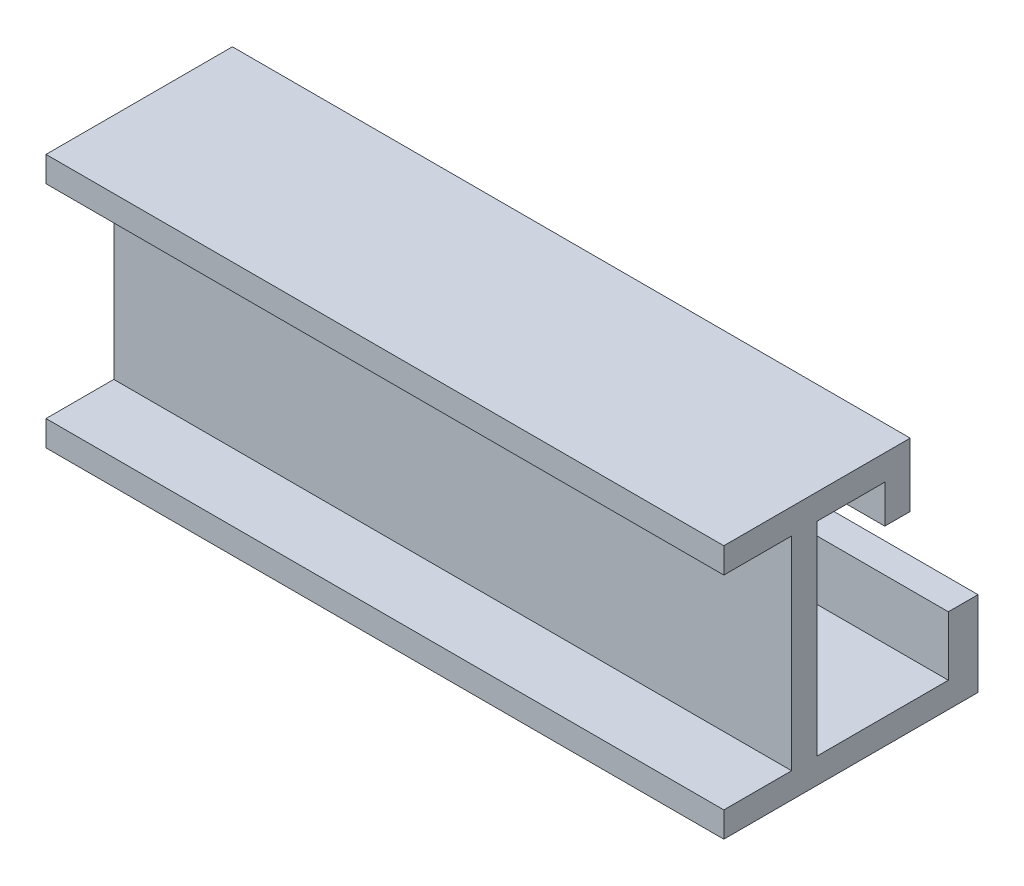
ISO-10303-21;
HEADER;
FILE_DESCRIPTION(('STEP AP214'),'2;1');
FILE_NAME('part.step','',(''),(''),'','','');
FILE_SCHEMA(('AUTOMOTIVE_DESIGN { 1 0 10303 214 1 1 1 1 }'));
ENDSEC;
DATA;
#1=APPLICATION_CONTEXT('core data for automotive mechanical design processes');
#2=APPLICATION_PROTOCOL_DEFINITION('international standard','automotive_design',2000,#1);
#3=PRODUCT_CONTEXT('',#1,'mechanical');
#4=PRODUCT('Part','Part','',(#3));
#5=PRODUCT_RELATED_PRODUCT_CATEGORY('part','',(#4));
#6=PRODUCT_DEFINITION_FORMATION('','',#4);
#7=PRODUCT_DEFINITION_CONTEXT('part definition',#1,'design');
#8=PRODUCT_DEFINITION('design','',#6,#7);
#9=PRODUCT_DEFINITION_SHAPE('','',#8);
#10=(LENGTH_UNIT() NAMED_UNIT(*) SI_UNIT(.MILLI.,.METRE.));
#11=(NAMED_UNIT(*) PLANE_ANGLE_UNIT() SI_UNIT($,.RADIAN.));
#12=(NAMED_UNIT(*) SI_UNIT($,.STERADIAN.) SOLID_ANGLE_UNIT());
#13=UNCERTAINTY_MEASURE_WITH_UNIT(LENGTH_MEASURE(1.E-05),#10,'distance_accuracy_value','');
#14=(GEOMETRIC_REPRESENTATION_CONTEXT(3) GLOBAL_UNCERTAINTY_ASSIGNED_CONTEXT((#13)) GLOBAL_UNIT_ASSIGNED_CONTEXT((#10,
#11,#12)) REPRESENTATION_CONTEXT('',''));
#15=CARTESIAN_POINT('',(0.,0.,0.));
#16=DIRECTION('',(0.,0.,1.));
#17=DIRECTION('',(1.,0.,0.));
#18=AXIS2_PLACEMENT_3D('',#15,#16,#17);
#19=CARTESIAN_POINT('',(80.,-10.,0.));
#20=DIRECTION('',(0.,1.,0.));
#21=DIRECTION('',(0.,0.,1.));
#22=AXIS2_PLACEMENT_3D('',#19,#20,#21);
#23=PLANE('',#22);
#24=DIRECTION('',(0.,0.,-1.));
#25=VECTOR('',#24,1.);
#26=CARTESIAN_POINT('',(-80.,-10.,0.));
#27=LINE('',#26,#25);
#28=CARTESIAN_POINT('',(-80.,-10.,-23.));
#29=VERTEX_POINT('',#28);
#30=CARTESIAN_POINT('',(-80.,-10.,-30.));
#31=VERTEX_POINT('',#30);
#32=EDGE_CURVE('E252',#29,#31,#27,.T.);
#33=ORIENTED_EDGE('',*,*,#32,.F.);
#34=DIRECTION('',(-1.,0.,0.));
#35=VECTOR('',#34,1.);
#36=CARTESIAN_POINT('',(80.,-10.,-23.));
#37=LINE('',#36,#35);
#38=CARTESIAN_POINT('',(80.,-10.,-23.));
#39=VERTEX_POINT('',#38);
#40=EDGE_CURVE('E11',#39,#29,#37,.T.);
#41=ORIENTED_EDGE('',*,*,#40,.F.);
#42=DIRECTION('',(0.,0.,-1.));
#43=VECTOR('',#42,1.);
#44=CARTESIAN_POINT('',(80.,-10.,0.));
#45=LINE('',#44,#43);
#46=CARTESIAN_POINT('',(80.,-10.,-30.));
#47=VERTEX_POINT('',#46);
#48=EDGE_CURVE('E207',#39,#47,#45,.T.);
#49=ORIENTED_EDGE('',*,*,#48,.T.);
#50=DIRECTION('',(-1.,0.,0.));
#51=VECTOR('',#50,1.);
#52=CARTESIAN_POINT('',(80.,-10.,-30.));
#53=LINE('',#52,#51);
#54=EDGE_CURVE('E111',#47,#31,#53,.T.);
#55=ORIENTED_EDGE('',*,*,#54,.T.);
#56=EDGE_LOOP('',(#33,#41,#49,#55));
#57=FACE_BOUND('',#56,.T.);
#58=ADVANCED_FACE('F37',(#57),#23,.T.);
#59=CARTESIAN_POINT('',(80.,0.,-23.));
#60=DIRECTION('',(0.,0.,1.));
#61=DIRECTION('',(1.,0.,0.));
#62=AXIS2_PLACEMENT_3D('',#59,#60,#61);
#63=PLANE('',#62);
#64=DIRECTION('',(0.,1.,0.));
#65=VECTOR('',#64,1.);
#66=CARTESIAN_POINT('',(-80.,0.,-23.));
#67=LINE('',#66,#65);
#68=CARTESIAN_POINT('',(-80.,-24.,-23.));
#69=VERTEX_POINT('',#68);
#70=EDGE_CURVE('E249',#69,#29,#67,.T.);
#71=ORIENTED_EDGE('',*,*,#70,.F.);
#72=DIRECTION('',(-1.,0.,0.));
#73=VECTOR('',#72,1.);
#74=CARTESIAN_POINT('',(80.,-24.,-23.));
#75=LINE('',#74,#73);
#76=CARTESIAN_POINT('',(80.,-24.,-23.));
#77=VERTEX_POINT('',#76);
#78=EDGE_CURVE('E45',#77,#69,#75,.T.);
#79=ORIENTED_EDGE('',*,*,#78,.F.);
#80=DIRECTION('',(0.,1.,0.));
#81=VECTOR('',#80,1.);
#82=CARTESIAN_POINT('',(80.,0.,-23.));
#83=LINE('',#82,#81);
#84=EDGE_CURVE('E204',#77,#39,#83,.T.);
#85=ORIENTED_EDGE('',*,*,#84,.T.);
#86=ORIENTED_EDGE('',*,*,#40,.T.);
#87=EDGE_LOOP('',(#71,#79,#85,#86));
#88=FACE_BOUND('',#87,.T.);
#89=ADVANCED_FACE('F250',(#88),#63,.T.);
#90=CARTESIAN_POINT('',(80.,-24.,0.));
#91=DIRECTION('',(0.,1.,0.));
#92=DIRECTION('',(0.,0.,1.));
#93=AXIS2_PLACEMENT_3D('',#90,#91,#92);
#94=PLANE('',#93);
#95=DIRECTION('',(0.,0.,-1.));
#96=VECTOR('',#95,1.);
#97=CARTESIAN_POINT('',(-80.,-24.,0.));
#98=LINE('',#97,#96);
#99=CARTESIAN_POINT('',(-80.,-24.,8.));
#100=VERTEX_POINT('',#99);
#101=EDGE_CURVE('E244',#100,#69,#98,.T.);
#102=ORIENTED_EDGE('',*,*,#101,.F.);
#103=DIRECTION('',(-1.,0.,0.));
#104=VECTOR('',#103,1.);
#105=CARTESIAN_POINT('',(80.,-24.,8.));
#106=LINE('',#105,#104);
#107=CARTESIAN_POINT('',(80.,-24.,8.));
#108=VERTEX_POINT('',#107);
#109=EDGE_CURVE('E238',#108,#100,#106,.T.);
#110=ORIENTED_EDGE('',*,*,#109,.F.);
#111=DIRECTION('',(0.,0.,-1.));
#112=VECTOR('',#111,1.);
#113=CARTESIAN_POINT('',(80.,-24.,0.));
#114=LINE('',#113,#112);
#115=EDGE_CURVE('E201',#108,#77,#114,.T.);
#116=ORIENTED_EDGE('',*,*,#115,.T.);
#117=ORIENTED_EDGE('',*,*,#78,.T.);
#118=EDGE_LOOP('',(#102,#110,#116,#117));
#119=FACE_BOUND('',#118,.T.);
#120=ADVANCED_FACE('F242',(#119),#94,.T.);
#121=CARTESIAN_POINT('',(80.,0.,8.));
#122=DIRECTION('',(0.,0.,1.));
#123=DIRECTION('',(1.,0.,0.));
#124=AXIS2_PLACEMENT_3D('',#121,#122,#123);
#125=PLANE('',#124);
#126=DIRECTION('',(0.,1.,0.));
#127=VECTOR('',#126,1.);
#128=CARTESIAN_POINT('',(-80.,0.,8.));
#129=LINE('',#128,#127);
#130=CARTESIAN_POINT('',(-80.,24.,8.));
#131=VERTEX_POINT('',#130);
#132=EDGE_CURVE('E258',#100,#131,#129,.T.);
#133=ORIENTED_EDGE('',*,*,#132,.T.);
#134=DIRECTION('',(-1.,0.,0.));
#135=VECTOR('',#134,1.);
#136=CARTESIAN_POINT('',(80.,24.,8.));
#137=LINE('',#136,#135);
#138=CARTESIAN_POINT('',(80.,24.,8.));
#139=VERTEX_POINT('',#138);
#140=EDGE_CURVE('E236',#139,#131,#137,.T.);
#141=ORIENTED_EDGE('',*,*,#140,.F.);
#142=DIRECTION('',(0.,1.,0.));
#143=VECTOR('',#142,1.);
#144=CARTESIAN_POINT('',(80.,0.,8.));
#145=LINE('',#144,#143);
#146=EDGE_CURVE('E199',#108,#139,#145,.T.);
#147=ORIENTED_EDGE('',*,*,#146,.F.);
#148=ORIENTED_EDGE('',*,*,#109,.T.);
#149=EDGE_LOOP('',(#133,#141,#147,#148));
#150=FACE_BOUND('',#149,.T.);
#151=ADVANCED_FACE('F322',(#150),#125,.F.);
#152=CARTESIAN_POINT('',(80.,24.,0.));
#153=DIRECTION('',(0.,-1.,0.));
#154=DIRECTION('',(0.,0.,-1.));
#155=AXIS2_PLACEMENT_3D('',#152,#153,#154);
#156=PLANE('',#155);
#157=DIRECTION('',(0.,0.,1.));
#158=VECTOR('',#157,1.);
#159=CARTESIAN_POINT('',(-80.,24.,0.));
#160=LINE('',#159,#158);
#161=CARTESIAN_POINT('',(-80.,24.,-8.));
#162=VERTEX_POINT('',#161);
#163=EDGE_CURVE('E260',#162,#131,#160,.T.);
#164=ORIENTED_EDGE('',*,*,#163,.F.);
#165=DIRECTION('',(-1.,0.,0.));
#166=VECTOR('',#165,1.);
#167=CARTESIAN_POINT('',(80.,24.,-8.));
#168=LINE('',#167,#166);
#169=CARTESIAN_POINT('',(80.,24.,-8.));
#170=VERTEX_POINT('',#169);
#171=EDGE_CURVE('E234',#170,#162,#168,.T.);
#172=ORIENTED_EDGE('',*,*,#171,.F.);
#173=DIRECTION('',(0.,0.,1.));
#174=VECTOR('',#173,1.);
#175=CARTESIAN_POINT('',(80.,24.,0.));
#176=LINE('',#175,#174);
#177=EDGE_CURVE('E196',#170,#139,#176,.T.);
#178=ORIENTED_EDGE('',*,*,#177,.T.);
#179=ORIENTED_EDGE('',*,*,#140,.T.);
#180=EDGE_LOOP('',(#164,#172,#178,#179));
#181=FACE_BOUND('',#180,.T.);
#182=ADVANCED_FACE('F318',(#181),#156,.T.);
#183=CARTESIAN_POINT('',(80.,0.,-8.));
#184=DIRECTION('',(0.,0.,1.));
#185=DIRECTION('',(1.,0.,0.));
#186=AXIS2_PLACEMENT_3D('',#183,#184,#185);
#187=PLANE('',#186);
#188=DIRECTION('',(0.,1.,0.));
#189=VECTOR('',#188,1.);
#190=CARTESIAN_POINT('',(-80.,0.,-8.));
#191=LINE('',#190,#189);
#192=CARTESIAN_POINT('',(-80.,15.,-8.));
#193=VERTEX_POINT('',#192);
#194=EDGE_CURVE('E265',#193,#162,#191,.T.);
#195=ORIENTED_EDGE('',*,*,#194,.F.);
#196=DIRECTION('',(-1.,0.,0.));
#197=VECTOR('',#196,1.);
#198=CARTESIAN_POINT('',(80.,15.,-8.));
#199=LINE('',#198,#197);
#200=CARTESIAN_POINT('',(80.,15.,-8.));
#201=VERTEX_POINT('',#200);
#202=EDGE_CURVE('E232',#201,#193,#199,.T.);
#203=ORIENTED_EDGE('',*,*,#202,.F.);
#204=DIRECTION('',(0.,1.,0.));
#205=VECTOR('',#204,1.);
#206=CARTESIAN_POINT('',(80.,0.,-8.));
#207=LINE('',#206,#205);
#208=EDGE_CURVE('E193',#201,#170,#207,.T.);
#209=ORIENTED_EDGE('',*,*,#208,.T.);
#210=ORIENTED_EDGE('',*,*,#171,.T.);
#211=EDGE_LOOP('',(#195,#203,#209,#210));
#212=FACE_BOUND('',#211,.T.);
#213=ADVANCED_FACE('F312',(#212),#187,.T.);
#214=CARTESIAN_POINT('',(80.,15.,0.));
#215=DIRECTION('',(0.,1.,0.));
#216=DIRECTION('',(0.,0.,1.));
#217=AXIS2_PLACEMENT_3D('',#214,#215,#216);
#218=PLANE('',#217);
#219=DIRECTION('',(0.,0.,-1.));
#220=VECTOR('',#219,1.);
#221=CARTESIAN_POINT('',(-80.,15.,0.));
#222=LINE('',#221,#220);
#223=CARTESIAN_POINT('',(-80.,15.,-14.));
#224=VERTEX_POINT('',#223);
#225=EDGE_CURVE('E268',#193,#224,#222,.T.);
#226=ORIENTED_EDGE('',*,*,#225,.T.);
#227=DIRECTION('',(-1.,0.,0.));
#228=VECTOR('',#227,1.);
#229=CARTESIAN_POINT('',(80.,15.,-14.));
#230=LINE('',#229,#228);
#231=CARTESIAN_POINT('',(80.,15.,-14.));
#232=VERTEX_POINT('',#231);
#233=EDGE_CURVE('E229',#232,#224,#230,.T.);
#234=ORIENTED_EDGE('',*,*,#233,.F.);
#235=DIRECTION('',(0.,0.,-1.));
#236=VECTOR('',#235,1.);
#237=CARTESIAN_POINT('',(80.,15.,0.));
#238=LINE('',#237,#236);
#239=EDGE_CURVE('E189',#201,#232,#238,.T.);
#240=ORIENTED_EDGE('',*,*,#239,.F.);
#241=ORIENTED_EDGE('',*,*,#202,.T.);
#242=EDGE_LOOP('',(#226,#234,#240,#241));
#243=FACE_BOUND('',#242,.T.);
#244=ADVANCED_FACE('F323',(#243),#218,.F.);
#245=CARTESIAN_POINT('',(80.,0.,-14.));
#246=DIRECTION('',(0.,0.,1.));
#247=DIRECTION('',(1.,0.,0.));
#248=AXIS2_PLACEMENT_3D('',#245,#246,#247);
#249=PLANE('',#248);
#250=DIRECTION('',(0.,1.,0.));
#251=VECTOR('',#250,1.);
#252=CARTESIAN_POINT('',(-80.,0.,-14.));
#253=LINE('',#252,#251);
#254=CARTESIAN_POINT('',(-80.,30.,-14.));
#255=VERTEX_POINT('',#254);
#256=EDGE_CURVE('E270',#224,#255,#253,.T.);
#257=ORIENTED_EDGE('',*,*,#256,.T.);
#258=DIRECTION('',(-1.,0.,0.));
#259=VECTOR('',#258,1.);
#260=CARTESIAN_POINT('',(80.,30.,-14.));
#261=LINE('',#260,#259);
#262=CARTESIAN_POINT('',(80.,30.,-14.));
#263=VERTEX_POINT('',#262);
#264=EDGE_CURVE('E227',#263,#255,#261,.T.);
#265=ORIENTED_EDGE('',*,*,#264,.F.);
#266=DIRECTION('',(0.,1.,0.));
#267=VECTOR('',#266,1.);
#268=CARTESIAN_POINT('',(80.,0.,-14.));
#269=LINE('',#268,#267);
#270=EDGE_CURVE('E186',#232,#263,#269,.T.);
#271=ORIENTED_EDGE('',*,*,#270,.F.);
#272=ORIENTED_EDGE('',*,*,#233,.T.);
#273=EDGE_LOOP('',(#257,#265,#271,#272));
#274=FACE_BOUND('',#273,.T.);
#275=ADVANCED_FACE('F306',(#274),#249,.F.);
#276=CARTESIAN_POINT('',(80.,30.,0.));
#277=DIRECTION('',(0.,1.,0.));
#278=DIRECTION('',(0.,0.,1.));
#279=AXIS2_PLACEMENT_3D('',#276,#277,#278);
#280=PLANE('',#279);
#281=DIRECTION('',(0.,0.,-1.));
#282=VECTOR('',#281,1.);
#283=CARTESIAN_POINT('',(-80.,30.,0.));
#284=LINE('',#283,#282);
#285=CARTESIAN_POINT('',(-80.,30.,30.));
#286=VERTEX_POINT('',#285);
#287=EDGE_CURVE('E273',#286,#255,#284,.T.);
#288=ORIENTED_EDGE('',*,*,#287,.F.);
#289=DIRECTION('',(-1.,0.,0.));
#290=VECTOR('',#289,1.);
#291=CARTESIAN_POINT('',(80.,30.,30.));
#292=LINE('',#291,#290);
#293=CARTESIAN_POINT('',(80.,30.,30.));
#294=VERTEX_POINT('',#293);
#295=EDGE_CURVE('E225',#294,#286,#292,.T.);
#296=ORIENTED_EDGE('',*,*,#295,.F.);
#297=DIRECTION('',(0.,0.,-1.));
#298=VECTOR('',#297,1.);
#299=CARTESIAN_POINT('',(80.,30.,0.));
#300=LINE('',#299,#298);
#301=EDGE_CURVE('E181',#294,#263,#300,.T.);
#302=ORIENTED_EDGE('',*,*,#301,.T.);
#303=ORIENTED_EDGE('',*,*,#264,.T.);
#304=EDGE_LOOP('',(#288,#296,#302,#303));
#305=FACE_BOUND('',#304,.T.);
#306=ADVANCED_FACE('F302',(#305),#280,.T.);
#307=CARTESIAN_POINT('',(80.,0.,30.));
#308=DIRECTION('',(0.,0.,1.));
#309=DIRECTION('',(1.,0.,0.));
#310=AXIS2_PLACEMENT_3D('',#307,#308,#309);
#311=PLANE('',#310);
#312=DIRECTION('',(0.,1.,0.));
#313=VECTOR('',#312,1.);
#314=CARTESIAN_POINT('',(-80.,0.,30.));
#315=LINE('',#314,#313);
#316=CARTESIAN_POINT('',(-80.,24.,30.));
#317=VERTEX_POINT('',#316);
#318=EDGE_CURVE('E276',#317,#286,#315,.T.);
#319=ORIENTED_EDGE('',*,*,#318,.F.);
#320=DIRECTION('',(-1.,0.,0.));
#321=VECTOR('',#320,1.);
#322=CARTESIAN_POINT('',(80.,24.,30.));
#323=LINE('',#322,#321);
#324=CARTESIAN_POINT('',(80.,24.,30.));
#325=VERTEX_POINT('',#324);
#326=EDGE_CURVE('E223',#325,#317,#323,.T.);
#327=ORIENTED_EDGE('',*,*,#326,.F.);
#328=DIRECTION('',(0.,1.,0.));
#329=VECTOR('',#328,1.);
#330=CARTESIAN_POINT('',(80.,0.,30.));
#331=LINE('',#330,#329);
#332=EDGE_CURVE('E174',#325,#294,#331,.T.);
#333=ORIENTED_EDGE('',*,*,#332,.T.);
#334=ORIENTED_EDGE('',*,*,#295,.T.);
#335=EDGE_LOOP('',(#319,#327,#333,#334));
#336=FACE_BOUND('',#335,.T.);
#337=ADVANCED_FACE('F301',(#336),#311,.T.);
#338=CARTESIAN_POINT('',(80.,24.,0.));
#339=DIRECTION('',(0.,-1.,0.));
#340=DIRECTION('',(0.,0.,-1.));
#341=AXIS2_PLACEMENT_3D('',#338,#339,#340);
#342=PLANE('',#341);
#343=DIRECTION('',(0.,0.,1.));
#344=VECTOR('',#343,1.);
#345=CARTESIAN_POINT('',(-80.,24.,0.));
#346=LINE('',#345,#344);
#347=CARTESIAN_POINT('',(-80.,24.,14.));
#348=VERTEX_POINT('',#347);
#349=EDGE_CURVE('E279',#348,#317,#346,.T.);
#350=ORIENTED_EDGE('',*,*,#349,.F.);
#351=DIRECTION('',(-1.,0.,0.));
#352=VECTOR('',#351,1.);
#353=CARTESIAN_POINT('',(80.,24.,14.));
#354=LINE('',#353,#352);
#355=CARTESIAN_POINT('',(80.,24.,14.));
#356=VERTEX_POINT('',#355);
#357=EDGE_CURVE('E221',#356,#348,#354,.T.);
#358=ORIENTED_EDGE('',*,*,#357,.F.);
#359=DIRECTION('',(0.,0.,1.));
#360=VECTOR('',#359,1.);
#361=CARTESIAN_POINT('',(80.,24.,0.));
#362=LINE('',#361,#360);
#363=EDGE_CURVE('E180',#356,#325,#362,.T.);
#364=ORIENTED_EDGE('',*,*,#363,.T.);
#365=ORIENTED_EDGE('',*,*,#326,.T.);
#366=EDGE_LOOP('',(#350,#358,#364,#365));
#367=FACE_BOUND('',#366,.T.);
#368=ADVANCED_FACE('F297',(#367),#342,.T.);
#369=CARTESIAN_POINT('',(80.,0.,14.));
#370=DIRECTION('',(0.,0.,1.));
#371=DIRECTION('',(1.,0.,0.));
#372=AXIS2_PLACEMENT_3D('',#369,#370,#371);
#373=PLANE('',#372);
#374=DIRECTION('',(0.,1.,0.));
#375=VECTOR('',#374,1.);
#376=CARTESIAN_POINT('',(-80.,0.,14.));
#377=LINE('',#376,#375);
#378=CARTESIAN_POINT('',(-80.,-24.,14.));
#379=VERTEX_POINT('',#378);
#380=EDGE_CURVE('E282',#379,#348,#377,.T.);
#381=ORIENTED_EDGE('',*,*,#380,.F.);
#382=DIRECTION('',(-1.,0.,0.));
#383=VECTOR('',#382,1.);
#384=CARTESIAN_POINT('',(80.,-24.,14.));
#385=LINE('',#384,#383);
#386=CARTESIAN_POINT('',(80.,-24.,14.));
#387=VERTEX_POINT('',#386);
#388=EDGE_CURVE('E219',#387,#379,#385,.T.);
#389=ORIENTED_EDGE('',*,*,#388,.F.);
#390=DIRECTION('',(0.,1.,0.));
#391=VECTOR('',#390,1.);
#392=CARTESIAN_POINT('',(80.,0.,14.));
#393=LINE('',#392,#391);
#394=EDGE_CURVE('E175',#387,#356,#393,.T.);
#395=ORIENTED_EDGE('',*,*,#394,.T.);
#396=ORIENTED_EDGE('',*,*,#357,.T.);
#397=EDGE_LOOP('',(#381,#389,#395,#396));
#398=FACE_BOUND('',#397,.T.);
#399=ADVANCED_FACE('F293',(#398),#373,.T.);
#400=CARTESIAN_POINT('',(80.,-24.,0.));
#401=DIRECTION('',(0.,-1.,0.));
#402=DIRECTION('',(0.,0.,-1.));
#403=AXIS2_PLACEMENT_3D('',#400,#401,#402);
#404=PLANE('',#403);
#405=DIRECTION('',(0.,0.,1.));
#406=VECTOR('',#405,1.);
#407=CARTESIAN_POINT('',(-80.,-24.,0.));
#408=LINE('',#407,#406);
#409=CARTESIAN_POINT('',(-80.,-24.,30.));
#410=VERTEX_POINT('',#409);
#411=EDGE_CURVE('E284',#379,#410,#408,.T.);
#412=ORIENTED_EDGE('',*,*,#411,.T.);
#413=DIRECTION('',(-1.,0.,0.));
#414=VECTOR('',#413,1.);
#415=CARTESIAN_POINT('',(80.,-24.,30.));
#416=LINE('',#415,#414);
#417=CARTESIAN_POINT('',(80.,-24.,30.));
#418=VERTEX_POINT('',#417);
#419=EDGE_CURVE('E162',#418,#410,#416,.T.);
#420=ORIENTED_EDGE('',*,*,#419,.F.);
#421=DIRECTION('',(0.,0.,1.));
#422=VECTOR('',#421,1.);
#423=CARTESIAN_POINT('',(80.,-24.,0.));
#424=LINE('',#423,#422);
#425=EDGE_CURVE('E171',#387,#418,#424,.T.);
#426=ORIENTED_EDGE('',*,*,#425,.F.);
#427=ORIENTED_EDGE('',*,*,#388,.T.);
#428=EDGE_LOOP('',(#412,#420,#426,#427));
#429=FACE_BOUND('',#428,.T.);
#430=ADVANCED_FACE('F395',(#429),#404,.F.);
#431=CARTESIAN_POINT('',(-80.,-30.,30.));
#432=VERTEX_POINT('',#431);
#433=EDGE_CURVE('E161',#432,#410,#315,.T.);
#434=ORIENTED_EDGE('',*,*,#433,.F.);
#435=DIRECTION('',(-1.,0.,0.));
#436=VECTOR('',#435,1.);
#437=CARTESIAN_POINT('',(80.,-30.,30.));
#438=LINE('',#437,#436);
#439=CARTESIAN_POINT('',(80.,-30.,30.));
#440=VERTEX_POINT('',#439);
#441=EDGE_CURVE('E155',#440,#432,#438,.T.);
#442=ORIENTED_EDGE('',*,*,#441,.F.);
#443=EDGE_CURVE('E159',#440,#418,#331,.T.);
#444=ORIENTED_EDGE('',*,*,#443,.T.);
#445=ORIENTED_EDGE('',*,*,#419,.T.);
#446=EDGE_LOOP('',(#434,#442,#444,#445));
#447=FACE_BOUND('',#446,.T.);
#448=ADVANCED_FACE('F157',(#447),#311,.T.);
#449=CARTESIAN_POINT('',(80.,-30.,0.));
#450=DIRECTION('',(0.,1.,0.));
#451=DIRECTION('',(0.,0.,1.));
#452=AXIS2_PLACEMENT_3D('',#449,#450,#451);
#453=PLANE('',#452);
#454=DIRECTION('',(0.,0.,-1.));
#455=VECTOR('',#454,1.);
#456=CARTESIAN_POINT('',(-80.,-30.,0.));
#457=LINE('',#456,#455);
#458=CARTESIAN_POINT('',(-80.,-30.,-30.));
#459=VERTEX_POINT('',#458);
#460=EDGE_CURVE('E104',#432,#459,#457,.T.);
#461=ORIENTED_EDGE('',*,*,#460,.T.);
#462=DIRECTION('',(-1.,0.,0.));
#463=VECTOR('',#462,1.);
#464=CARTESIAN_POINT('',(80.,-30.,-30.));
#465=LINE('',#464,#463);
#466=CARTESIAN_POINT('',(80.,-30.,-30.));
#467=VERTEX_POINT('',#466);
#468=EDGE_CURVE('E163',#467,#459,#465,.T.);
#469=ORIENTED_EDGE('',*,*,#468,.F.);
#470=DIRECTION('',(0.,0.,-1.));
#471=VECTOR('',#470,1.);
#472=CARTESIAN_POINT('',(80.,-30.,0.));
#473=LINE('',#472,#471);
#474=EDGE_CURVE('E165',#440,#467,#473,.T.);
#475=ORIENTED_EDGE('',*,*,#474,.F.);
#476=ORIENTED_EDGE('',*,*,#441,.T.);
#477=EDGE_LOOP('',(#461,#469,#475,#476));
#478=FACE_BOUND('',#477,.T.);
#479=ADVANCED_FACE('F166',(#478),#453,.F.);
#480=CARTESIAN_POINT('',(80.,0.,-30.));
#481=DIRECTION('',(0.,0.,1.));
#482=DIRECTION('',(1.,0.,0.));
#483=AXIS2_PLACEMENT_3D('',#480,#481,#482);
#484=PLANE('',#483);
#485=DIRECTION('',(0.,1.,0.));
#486=VECTOR('',#485,1.);
#487=CARTESIAN_POINT('',(-80.,0.,-30.));
#488=LINE('',#487,#486);
#489=EDGE_CURVE('E208',#459,#31,#488,.T.);
#490=ORIENTED_EDGE('',*,*,#489,.T.);
#491=ORIENTED_EDGE('',*,*,#54,.F.);
#492=DIRECTION('',(0.,1.,0.));
#493=VECTOR('',#492,1.);
#494=CARTESIAN_POINT('',(80.,0.,-30.));
#495=LINE('',#494,#493);
#496=EDGE_CURVE('E53',#467,#47,#495,.T.);
#497=ORIENTED_EDGE('',*,*,#496,.F.);
#498=ORIENTED_EDGE('',*,*,#468,.T.);
#499=EDGE_LOOP('',(#490,#491,#497,#498));
#500=FACE_BOUND('',#499,.T.);
#501=ADVANCED_FACE('F419',(#500),#484,.F.);
#502=CARTESIAN_POINT('',(80.,0.,0.));
#503=DIRECTION('',(1.,0.,0.));
#504=DIRECTION('',(0.,0.,-1.));
#505=AXIS2_PLACEMENT_3D('',#502,#503,#504);
#506=PLANE('',#505);
#507=ORIENTED_EDGE('',*,*,#48,.F.);
#508=ORIENTED_EDGE('',*,*,#84,.F.);
#509=ORIENTED_EDGE('',*,*,#115,.F.);
#510=ORIENTED_EDGE('',*,*,#146,.T.);
#511=ORIENTED_EDGE('',*,*,#177,.F.);
#512=ORIENTED_EDGE('',*,*,#208,.F.);
#513=ORIENTED_EDGE('',*,*,#239,.T.);
#514=ORIENTED_EDGE('',*,*,#270,.T.);
#515=ORIENTED_EDGE('',*,*,#301,.F.);
#516=ORIENTED_EDGE('',*,*,#332,.F.);
#517=ORIENTED_EDGE('',*,*,#363,.F.);
#518=ORIENTED_EDGE('',*,*,#394,.F.);
#519=ORIENTED_EDGE('',*,*,#425,.T.);
#520=ORIENTED_EDGE('',*,*,#443,.F.);
#521=ORIENTED_EDGE('',*,*,#474,.T.);
#522=ORIENTED_EDGE('',*,*,#496,.T.);
#523=EDGE_LOOP('',(#507,#508,#509,#510,#511,#512,#513,#514,#515,#516,#517,#518,#519,#520,#521,#522));
#524=FACE_BOUND('',#523,.T.);
#525=ADVANCED_FACE('F168',(#524),#506,.T.);
#526=CARTESIAN_POINT('',(-80.,0.,0.));
#527=DIRECTION('',(1.,0.,0.));
#528=DIRECTION('',(0.,0.,-1.));
#529=AXIS2_PLACEMENT_3D('',#526,#527,#528);
#530=PLANE('',#529);
#531=ORIENTED_EDGE('',*,*,#32,.T.);
#532=ORIENTED_EDGE('',*,*,#489,.F.);
#533=ORIENTED_EDGE('',*,*,#460,.F.);
#534=ORIENTED_EDGE('',*,*,#433,.T.);
#535=ORIENTED_EDGE('',*,*,#411,.F.);
#536=ORIENTED_EDGE('',*,*,#380,.T.);
#537=ORIENTED_EDGE('',*,*,#349,.T.);
#538=ORIENTED_EDGE('',*,*,#318,.T.);
#539=ORIENTED_EDGE('',*,*,#287,.T.);
#540=ORIENTED_EDGE('',*,*,#256,.F.);
#541=ORIENTED_EDGE('',*,*,#225,.F.);
#542=ORIENTED_EDGE('',*,*,#194,.T.);
#543=ORIENTED_EDGE('',*,*,#163,.T.);
#544=ORIENTED_EDGE('',*,*,#132,.F.);
#545=ORIENTED_EDGE('',*,*,#101,.T.);
#546=ORIENTED_EDGE('',*,*,#70,.T.);
#547=EDGE_LOOP('',(#531,#532,#533,#534,#535,#536,#537,#538,#539,#540,#541,#542,#543,#544,#545,#546));
#548=FACE_BOUND('',#547,.T.);
#549=ADVANCED_FACE('F255',(#548),#530,.F.);
#550=CLOSED_SHELL('',(#58,#89,#120,#151,#182,#213,#244,#275,#306,#337,#368,#399,#430,#448,#479,
#501,#525,#549));
#551=MANIFOLD_SOLID_BREP('B2',#550);
#552=ADVANCED_BREP_SHAPE_REPRESENTATION('',(#18,#551),#14);
#553=SHAPE_DEFINITION_REPRESENTATION(#9,#552);
ENDSEC;
END-ISO-10303-21;
